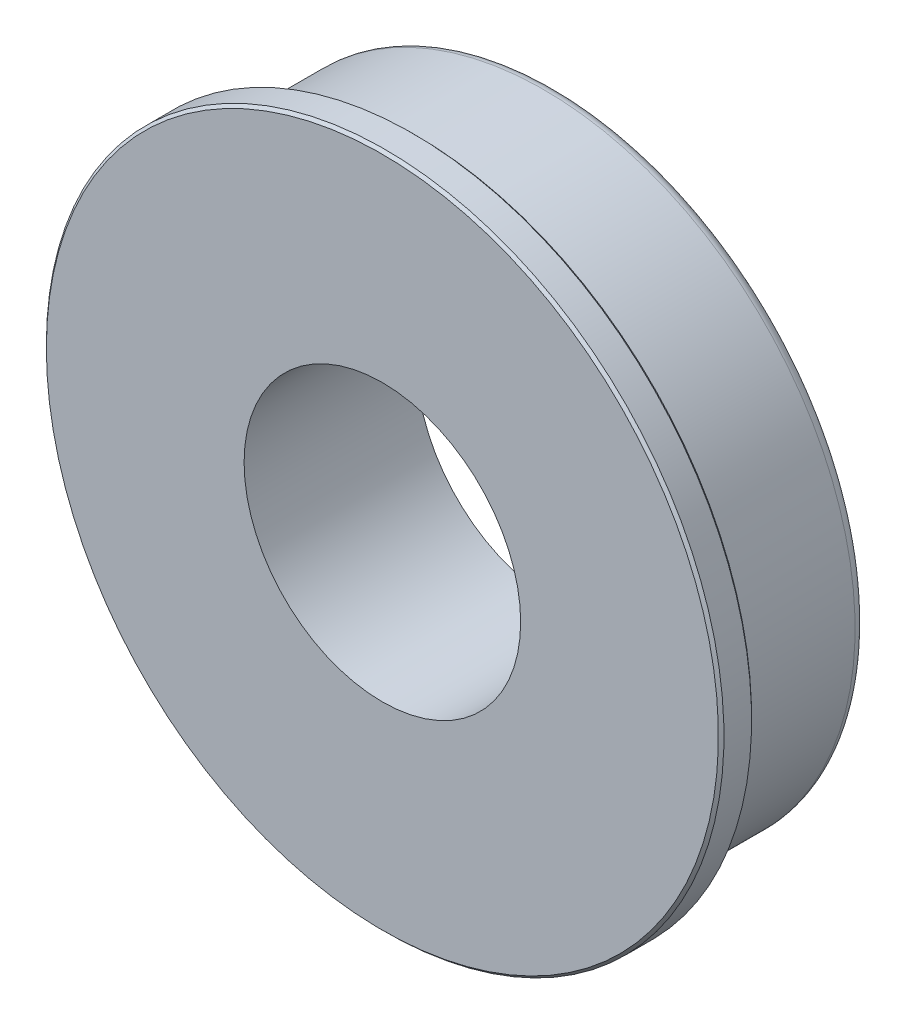
ISO-10303-21;
HEADER;
FILE_DESCRIPTION(('STEP AP214'),'2;1');
FILE_NAME('part.step','',(''),(''),'','','');
FILE_SCHEMA(('AUTOMOTIVE_DESIGN { 1 0 10303 214 1 1 1 1 }'));
ENDSEC;
DATA;
#1=APPLICATION_CONTEXT('core data for automotive mechanical design processes');
#2=APPLICATION_PROTOCOL_DEFINITION('international standard','automotive_design',2000,#1);
#3=PRODUCT_CONTEXT('',#1,'mechanical');
#4=PRODUCT('Part','Part','',(#3));
#5=PRODUCT_RELATED_PRODUCT_CATEGORY('part','',(#4));
#6=PRODUCT_DEFINITION_FORMATION('','',#4);
#7=PRODUCT_DEFINITION_CONTEXT('part definition',#1,'design');
#8=PRODUCT_DEFINITION('design','',#6,#7);
#9=PRODUCT_DEFINITION_SHAPE('','',#8);
#10=(LENGTH_UNIT() NAMED_UNIT(*) SI_UNIT(.MILLI.,.METRE.));
#11=(NAMED_UNIT(*) PLANE_ANGLE_UNIT() SI_UNIT($,.RADIAN.));
#12=(NAMED_UNIT(*) SI_UNIT($,.STERADIAN.) SOLID_ANGLE_UNIT());
#13=UNCERTAINTY_MEASURE_WITH_UNIT(LENGTH_MEASURE(1.E-05),#10,'distance_accuracy_value','');
#14=(GEOMETRIC_REPRESENTATION_CONTEXT(3) GLOBAL_UNCERTAINTY_ASSIGNED_CONTEXT((#13)) GLOBAL_UNIT_ASSIGNED_CONTEXT((#10,
#11,#12)) REPRESENTATION_CONTEXT('',''));
#15=CARTESIAN_POINT('',(0.,0.,0.));
#16=DIRECTION('',(0.,0.,1.));
#17=DIRECTION('',(1.,0.,0.));
#18=AXIS2_PLACEMENT_3D('',#15,#16,#17);
#19=CARTESIAN_POINT('',(0.,0.,0.508000000000006));
#20=DIRECTION('',(0.,0.,-1.));
#21=DIRECTION('',(-1.,0.,0.));
#22=AXIS2_PLACEMENT_3D('',#19,#20,#21);
#23=TOROIDAL_SURFACE('',#22,13.7795,0.508000000000002);
#24=CARTESIAN_POINT('',(0.,0.,0.508));
#25=DIRECTION('',(0.,0.,-1.));
#26=DIRECTION('',(-1.,0.,0.));
#27=AXIS2_PLACEMENT_3D('',#24,#25,#26);
#28=CIRCLE('',#27,14.2875);
#29=CARTESIAN_POINT('',(-14.2875,0.,0.508));
#30=VERTEX_POINT('',#29);
#31=EDGE_CURVE('E10',#30,#30,#28,.T.);
#32=ORIENTED_EDGE('',*,*,#31,.T.);
#33=EDGE_LOOP('',(#32));
#34=FACE_BOUND('',#33,.T.);
#35=CARTESIAN_POINT('',(0.,0.,0.));
#36=DIRECTION('',(0.,0.,-1.));
#37=DIRECTION('',(-1.,0.,0.));
#38=AXIS2_PLACEMENT_3D('',#35,#36,#37);
#39=CIRCLE('',#38,13.7795);
#40=CARTESIAN_POINT('',(-13.7795,0.,0.));
#41=VERTEX_POINT('',#40);
#42=EDGE_CURVE('E67',#41,#41,#39,.T.);
#43=ORIENTED_EDGE('',*,*,#42,.F.);
#44=EDGE_LOOP('',(#43));
#45=FACE_BOUND('',#44,.T.);
#46=ADVANCED_FACE('F30',(#34,#45),#23,.T.);
#47=CARTESIAN_POINT('',(0.,0.,7.92734));
#48=DIRECTION('',(0.,0.,-1.));
#49=DIRECTION('',(-1.,0.,0.));
#50=AXIS2_PLACEMENT_3D('',#47,#48,#49);
#51=CYLINDRICAL_SURFACE('',#50,14.2875);
#52=CARTESIAN_POINT('',(0.,0.,5.89534));
#53=DIRECTION('',(0.,0.,-1.));
#54=DIRECTION('',(-1.,0.,0.));
#55=AXIS2_PLACEMENT_3D('',#52,#53,#54);
#56=CIRCLE('',#55,14.2875);
#57=CARTESIAN_POINT('',(-14.2875,0.,5.89534));
#58=VERTEX_POINT('',#57);
#59=EDGE_CURVE('E36',#58,#58,#56,.T.);
#60=ORIENTED_EDGE('',*,*,#59,.T.);
#61=EDGE_LOOP('',(#60));
#62=FACE_BOUND('',#61,.T.);
#63=ORIENTED_EDGE('',*,*,#31,.F.);
#64=EDGE_LOOP('',(#63));
#65=FACE_BOUND('',#64,.T.);
#66=ADVANCED_FACE('F75',(#62,#65),#51,.T.);
#67=CARTESIAN_POINT('',(14.2875,0.,5.89534000000001));
#68=DIRECTION('',(0.,0.,1.));
#69=DIRECTION('',(1.,0.,0.));
#70=AXIS2_PLACEMENT_3D('',#67,#68,#69);
#71=PLANE('',#70);
#72=CARTESIAN_POINT('',(0.,0.,5.89534000000002));
#73=DIRECTION('',(0.,0.,-1.));
#74=DIRECTION('',(-1.,0.,0.));
#75=AXIS2_PLACEMENT_3D('',#72,#73,#74);
#76=CIRCLE('',#75,13.9699999999997);
#77=CARTESIAN_POINT('',(-13.9699999999997,0.,5.89534000000002));
#78=VERTEX_POINT('',#77);
#79=EDGE_CURVE('E40',#78,#78,#76,.T.);
#80=ORIENTED_EDGE('',*,*,#79,.T.);
#81=EDGE_LOOP('',(#80));
#82=FACE_BOUND('',#81,.T.);
#83=ORIENTED_EDGE('',*,*,#59,.F.);
#84=EDGE_LOOP('',(#83));
#85=FACE_BOUND('',#84,.T.);
#86=ADVANCED_FACE('F79',(#82,#85),#71,.T.);
#87=CARTESIAN_POINT('',(0.,0.,7.92734));
#88=DIRECTION('',(0.,0.,-1.));
#89=DIRECTION('',(-1.,0.,0.));
#90=AXIS2_PLACEMENT_3D('',#87,#88,#89);
#91=CYLINDRICAL_SURFACE('',#90,13.9699999999997);
#92=CARTESIAN_POINT('',(0.,0.,6.40334000000001));
#93=DIRECTION('',(0.,0.,-1.));
#94=DIRECTION('',(-1.,0.,0.));
#95=AXIS2_PLACEMENT_3D('',#92,#93,#94);
#96=CIRCLE('',#95,13.9699999999997);
#97=CARTESIAN_POINT('',(-13.9699999999997,0.,6.40334000000001));
#98=VERTEX_POINT('',#97);
#99=EDGE_CURVE('E44',#98,#98,#96,.T.);
#100=ORIENTED_EDGE('',*,*,#99,.T.);
#101=EDGE_LOOP('',(#100));
#102=FACE_BOUND('',#101,.T.);
#103=ORIENTED_EDGE('',*,*,#79,.F.);
#104=EDGE_LOOP('',(#103));
#105=FACE_BOUND('',#104,.T.);
#106=ADVANCED_FACE('F83',(#102,#105),#91,.T.);
#107=CARTESIAN_POINT('',(13.9699999999997,0.,6.40334000000001));
#108=DIRECTION('',(0.,0.,-1.));
#109=DIRECTION('',(-1.,0.,0.));
#110=AXIS2_PLACEMENT_3D('',#107,#108,#109);
#111=PLANE('',#110);
#112=CARTESIAN_POINT('',(0.,0.,6.40334000000001));
#113=DIRECTION('',(0.,0.,-1.));
#114=DIRECTION('',(-1.,0.,0.));
#115=AXIS2_PLACEMENT_3D('',#112,#113,#114);
#116=CIRCLE('',#115,15.4304999999997);
#117=CARTESIAN_POINT('',(-15.4304999999997,0.,6.40334000000001));
#118=VERTEX_POINT('',#117);
#119=EDGE_CURVE('E49',#118,#118,#116,.T.);
#120=ORIENTED_EDGE('',*,*,#119,.T.);
#121=EDGE_LOOP('',(#120));
#122=FACE_BOUND('',#121,.T.);
#123=ORIENTED_EDGE('',*,*,#99,.F.);
#124=EDGE_LOOP('',(#123));
#125=FACE_BOUND('',#124,.T.);
#126=ADVANCED_FACE('F90',(#122,#125),#111,.T.);
#127=CARTESIAN_POINT('',(0.,0.,6.40334000000001));
#128=DIRECTION('',(0.,0.,1.));
#129=DIRECTION('',(1.,0.,0.));
#130=AXIS2_PLACEMENT_3D('',#127,#128,#129);
#131=CONICAL_SURFACE('',#130,15.4304999999997,0.785398163397445);
#132=CARTESIAN_POINT('',(0.,0.,6.53034000000001));
#133=DIRECTION('',(0.,0.,-1.));
#134=DIRECTION('',(-1.,0.,0.));
#135=AXIS2_PLACEMENT_3D('',#132,#133,#134);
#136=CIRCLE('',#135,15.5574999999997);
#137=CARTESIAN_POINT('',(-15.5574999999997,0.,6.53034000000001));
#138=VERTEX_POINT('',#137);
#139=EDGE_CURVE('E52',#138,#138,#136,.T.);
#140=ORIENTED_EDGE('',*,*,#139,.T.);
#141=EDGE_LOOP('',(#140));
#142=FACE_BOUND('',#141,.T.);
#143=ORIENTED_EDGE('',*,*,#119,.F.);
#144=EDGE_LOOP('',(#143));
#145=FACE_BOUND('',#144,.T.);
#146=ADVANCED_FACE('F94',(#142,#145),#131,.T.);
#147=CARTESIAN_POINT('',(0.,0.,7.92734));
#148=DIRECTION('',(0.,0.,-1.));
#149=DIRECTION('',(-1.,0.,0.));
#150=AXIS2_PLACEMENT_3D('',#147,#148,#149);
#151=CYLINDRICAL_SURFACE('',#150,15.5574999999997);
#152=CARTESIAN_POINT('',(0.,0.,7.80034));
#153=DIRECTION('',(0.,0.,-1.));
#154=DIRECTION('',(-1.,0.,0.));
#155=AXIS2_PLACEMENT_3D('',#152,#153,#154);
#156=CIRCLE('',#155,15.5574999999997);
#157=CARTESIAN_POINT('',(-15.5574999999997,0.,7.80034));
#158=VERTEX_POINT('',#157);
#159=EDGE_CURVE('E55',#158,#158,#156,.T.);
#160=ORIENTED_EDGE('',*,*,#159,.T.);
#161=EDGE_LOOP('',(#160));
#162=FACE_BOUND('',#161,.T.);
#163=ORIENTED_EDGE('',*,*,#139,.F.);
#164=EDGE_LOOP('',(#163));
#165=FACE_BOUND('',#164,.T.);
#166=ADVANCED_FACE('F98',(#162,#165),#151,.T.);
#167=CARTESIAN_POINT('',(0.,0.,7.80034));
#168=DIRECTION('',(0.,0.,-1.));
#169=DIRECTION('',(-1.,0.,0.));
#170=AXIS2_PLACEMENT_3D('',#167,#168,#169);
#171=CONICAL_SURFACE('',#170,15.5574999999997,0.785398163397448);
#172=CARTESIAN_POINT('',(0.,0.,7.92734));
#173=DIRECTION('',(0.,0.,-1.));
#174=DIRECTION('',(-1.,0.,0.));
#175=AXIS2_PLACEMENT_3D('',#172,#173,#174);
#176=CIRCLE('',#175,15.4304999999997);
#177=CARTESIAN_POINT('',(-15.4304999999997,0.,7.92734));
#178=VERTEX_POINT('',#177);
#179=EDGE_CURVE('E58',#178,#178,#176,.T.);
#180=ORIENTED_EDGE('',*,*,#179,.T.);
#181=EDGE_LOOP('',(#180));
#182=FACE_BOUND('',#181,.T.);
#183=ORIENTED_EDGE('',*,*,#159,.F.);
#184=EDGE_LOOP('',(#183));
#185=FACE_BOUND('',#184,.T.);
#186=ADVANCED_FACE('F102',(#182,#185),#171,.T.);
#187=CARTESIAN_POINT('',(15.4304999999997,0.,7.92734));
#188=DIRECTION('',(0.,0.,1.));
#189=DIRECTION('',(1.,0.,0.));
#190=AXIS2_PLACEMENT_3D('',#187,#188,#189);
#191=PLANE('',#190);
#192=CARTESIAN_POINT('',(0.,0.,7.92734));
#193=DIRECTION('',(0.,0.,-1.));
#194=DIRECTION('',(-1.,0.,0.));
#195=AXIS2_PLACEMENT_3D('',#192,#193,#194);
#196=CIRCLE('',#195,6.35000000000001);
#197=CARTESIAN_POINT('',(-6.35000000000001,0.,7.92734));
#198=VERTEX_POINT('',#197);
#199=EDGE_CURVE('E61',#198,#198,#196,.T.);
#200=ORIENTED_EDGE('',*,*,#199,.T.);
#201=EDGE_LOOP('',(#200));
#202=FACE_BOUND('',#201,.T.);
#203=ORIENTED_EDGE('',*,*,#179,.F.);
#204=EDGE_LOOP('',(#203));
#205=FACE_BOUND('',#204,.T.);
#206=ADVANCED_FACE('F106',(#202,#205),#191,.T.);
#207=CARTESIAN_POINT('',(0.,0.,7.92734));
#208=DIRECTION('',(0.,0.,-1.));
#209=DIRECTION('',(-1.,0.,0.));
#210=AXIS2_PLACEMENT_3D('',#207,#208,#209);
#211=CYLINDRICAL_SURFACE('',#210,6.35000000000001);
#212=CARTESIAN_POINT('',(0.,0.,0.));
#213=DIRECTION('',(0.,0.,-1.));
#214=DIRECTION('',(-1.,0.,0.));
#215=AXIS2_PLACEMENT_3D('',#212,#213,#214);
#216=CIRCLE('',#215,6.35000000000001);
#217=CARTESIAN_POINT('',(-6.35000000000001,0.,0.));
#218=VERTEX_POINT('',#217);
#219=EDGE_CURVE('E64',#218,#218,#216,.T.);
#220=ORIENTED_EDGE('',*,*,#219,.T.);
#221=EDGE_LOOP('',(#220));
#222=FACE_BOUND('',#221,.T.);
#223=ORIENTED_EDGE('',*,*,#199,.F.);
#224=EDGE_LOOP('',(#223));
#225=FACE_BOUND('',#224,.T.);
#226=ADVANCED_FACE('F110',(#222,#225),#211,.F.);
#227=CARTESIAN_POINT('',(6.35000000000001,0.,0.));
#228=DIRECTION('',(0.,0.,-1.));
#229=DIRECTION('',(-1.,0.,0.));
#230=AXIS2_PLACEMENT_3D('',#227,#228,#229);
#231=PLANE('',#230);
#232=ORIENTED_EDGE('',*,*,#42,.T.);
#233=EDGE_LOOP('',(#232));
#234=FACE_BOUND('',#233,.T.);
#235=ORIENTED_EDGE('',*,*,#219,.F.);
#236=EDGE_LOOP('',(#235));
#237=FACE_BOUND('',#236,.T.);
#238=ADVANCED_FACE('F71',(#234,#237),#231,.T.);
#239=CLOSED_SHELL('',(#46,#66,#86,#106,#126,#146,#166,#186,#206,#226,#238));
#240=MANIFOLD_SOLID_BREP('B2',#239);
#241=ADVANCED_BREP_SHAPE_REPRESENTATION('',(#18,#240),#14);
#242=SHAPE_DEFINITION_REPRESENTATION(#9,#241);
ENDSEC;
END-ISO-10303-21;
